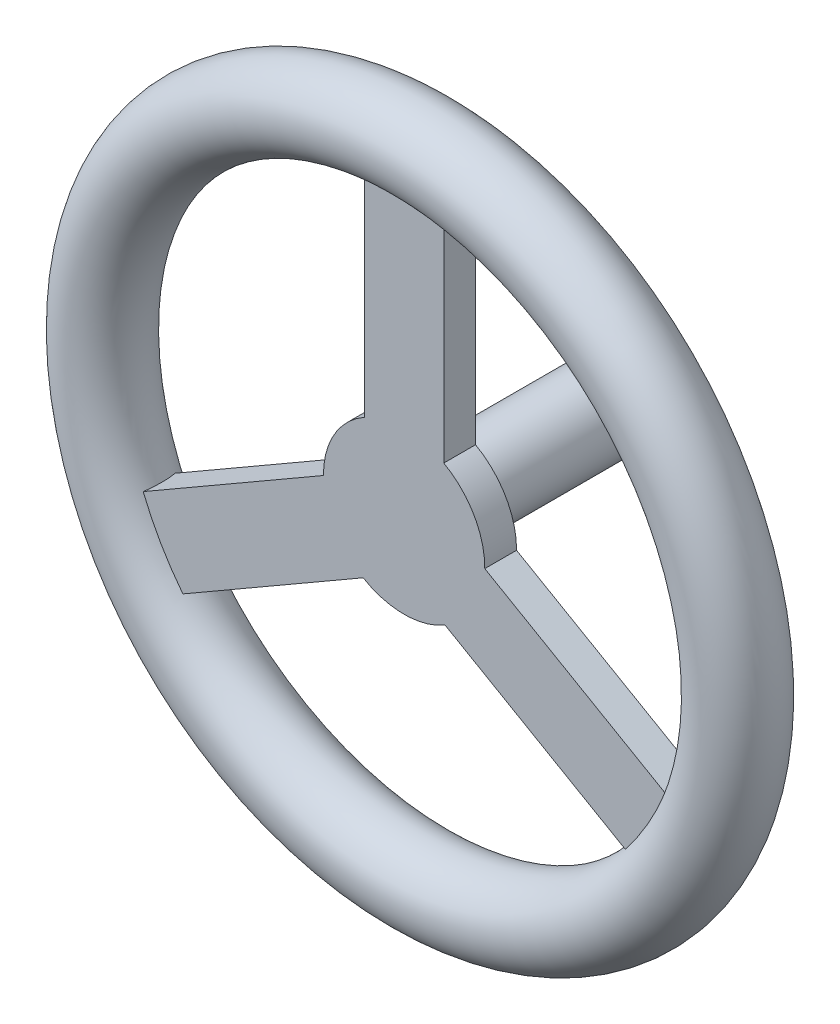
ISO-10303-21;
HEADER;
FILE_DESCRIPTION(('STEP AP214'),'2;1');
FILE_NAME('part.step','',(''),(''),'','','');
FILE_SCHEMA(('AUTOMOTIVE_DESIGN { 1 0 10303 214 1 1 1 1 }'));
ENDSEC;
DATA;
#1=APPLICATION_CONTEXT('core data for automotive mechanical design processes');
#2=APPLICATION_PROTOCOL_DEFINITION('international standard','automotive_design',2000,#1);
#3=PRODUCT_CONTEXT('',#1,'mechanical');
#4=PRODUCT('Part','Part','',(#3));
#5=PRODUCT_RELATED_PRODUCT_CATEGORY('part','',(#4));
#6=PRODUCT_DEFINITION_FORMATION('','',#4);
#7=PRODUCT_DEFINITION_CONTEXT('part definition',#1,'design');
#8=PRODUCT_DEFINITION('design','',#6,#7);
#9=PRODUCT_DEFINITION_SHAPE('','',#8);
#10=(LENGTH_UNIT() NAMED_UNIT(*) SI_UNIT(.MILLI.,.METRE.));
#11=(NAMED_UNIT(*) PLANE_ANGLE_UNIT() SI_UNIT($,.RADIAN.));
#12=(NAMED_UNIT(*) SI_UNIT($,.STERADIAN.) SOLID_ANGLE_UNIT());
#13=UNCERTAINTY_MEASURE_WITH_UNIT(LENGTH_MEASURE(1.E-05),#10,'distance_accuracy_value','');
#14=(GEOMETRIC_REPRESENTATION_CONTEXT(3) GLOBAL_UNCERTAINTY_ASSIGNED_CONTEXT((#13)) GLOBAL_UNIT_ASSIGNED_CONTEXT((#10,
#11,#12)) REPRESENTATION_CONTEXT('',''));
#15=CARTESIAN_POINT('',(0.,0.,0.));
#16=DIRECTION('',(0.,0.,1.));
#17=DIRECTION('',(1.,0.,0.));
#18=AXIS2_PLACEMENT_3D('',#15,#16,#17);
#19=CARTESIAN_POINT('',(6.25,-10.8253175473055,5.));
#20=DIRECTION('',(0.5,-0.866025403784439,0.));
#21=DIRECTION('',(0.866025403784439,0.5,0.));
#22=AXIS2_PLACEMENT_3D('',#19,#20,#21);
#23=PLANE('',#22);
#24=CARTESIAN_POINT('',(-69.6630799516573,-54.6537546924084,-5.0002));
#25=CARTESIAN_POINT('',(-69.5413531107413,-54.5834756680379,-4.68147860284593));
#26=CARTESIAN_POINT('',(-69.4312808888809,-54.5199254411166,-4.35682505741034));
#27=CARTESIAN_POINT('',(-69.2351308625508,-54.4066781706133,-3.69799138557129));
#28=CARTESIAN_POINT('',(-69.1490531545319,-54.3569811827174,-3.36381122087957));
#29=CARTESIAN_POINT('',(-69.0015696622864,-54.2718315487684,-2.6882249452108));
#30=CARTESIAN_POINT('',(-68.9401667776476,-54.2363805767932,-2.34681798995851));
#31=CARTESIAN_POINT('',(-68.8425057023006,-54.1799959286522,-1.65925928260714));
#32=CARTESIAN_POINT('',(-68.806246267319,-54.159061534105,-1.31310776616666));
#33=CARTESIAN_POINT('',(-68.759125960518,-54.1318566122891,-0.618210637502748));
#34=CARTESIAN_POINT('',(-68.7482867045349,-54.1255985649294,-0.269463070324603));
#35=CARTESIAN_POINT('',(-68.7521522750239,-54.1278303530918,0.427843293739784));
#36=CARTESIAN_POINT('',(-68.766857072376,-54.1363201718015,0.776402090840771));
#37=CARTESIAN_POINT('',(-68.8216614964472,-54.1679615207917,1.47037344266194));
#38=CARTESIAN_POINT('',(-68.8617270385241,-54.1910933722951,1.81578959001101));
#39=CARTESIAN_POINT('',(-68.9668970619562,-54.2518133136343,2.50137145902106));
#40=CARTESIAN_POINT('',(-69.0319919676568,-54.2893958749634,2.84153913692139));
#41=CARTESIAN_POINT('',(-69.1810286594354,-54.3754422490809,3.48954055940823));
#42=CARTESIAN_POINT('',(-69.2632289201448,-54.4229005917289,3.79791029589679));
#43=CARTESIAN_POINT('',(-69.448014139167,-54.5295863876737,4.40593080431716));
#44=CARTESIAN_POINT('',(-69.5505715955726,-54.5887979627368,4.70559272081878));
#45=CARTESIAN_POINT('',(-69.6630799516573,-54.6537546924084,5.0002));
#46=B_SPLINE_CURVE_WITH_KNOTS('',3,(#24,#25,#26,#27,#28,#29,#30,#31,#32,#33,#34,#35,#36,#37,#38,
#39,#40,#41,#42,#43,#44,#45),.UNSPECIFIED.,.F.,.F.,(4,2,2,2,2,2,2,2,2,2,4),(0.,1.04470646154977,
2.0894171224509,3.1342505135145,4.17903219524394,5.22470197670053,6.2703705661003,
7.31463676046712,8.35850383965663,9.32547700818342,10.2911526111836),.UNSPECIFIED.);
#47=CARTESIAN_POINT('',(-69.6630035922144,-54.6537106062635,-5.));
#48=VERTEX_POINT('',#47);
#49=CARTESIAN_POINT('',(-69.6630035922144,-54.6537106062635,5.));
#50=VERTEX_POINT('',#49);
#51=EDGE_CURVE('E207',#48,#50,#46,.T.);
#52=ORIENTED_EDGE('',*,*,#51,.F.);
#53=DIRECTION('',(-0.866025403784439,-0.5,0.));
#54=VECTOR('',#53,1.);
#55=CARTESIAN_POINT('',(6.25,-10.8253175473055,-5.));
#56=LINE('',#55,#54);
#57=CARTESIAN_POINT('',(-12.8989555850965,-21.8809722090612,-5.));
#58=VERTEX_POINT('',#57);
#59=EDGE_CURVE('E128',#58,#48,#56,.T.);
#60=ORIENTED_EDGE('',*,*,#59,.F.);
#61=DIRECTION('',(0.,0.,-1.));
#62=VECTOR('',#61,1.);
#63=CARTESIAN_POINT('',(-12.8989555850965,-21.8809722090612,5.));
#64=LINE('',#63,#62);
#65=CARTESIAN_POINT('',(-12.8989555850965,-21.8809722090612,5.));
#66=VERTEX_POINT('',#65);
#67=EDGE_CURVE('E122',#66,#58,#64,.T.);
#68=ORIENTED_EDGE('',*,*,#67,.F.);
#69=DIRECTION('',(-0.866025403784439,-0.5,0.));
#70=VECTOR('',#69,1.);
#71=CARTESIAN_POINT('',(6.25,-10.8253175473055,5.));
#72=LINE('',#71,#70);
#73=EDGE_CURVE('E126',#66,#50,#72,.T.);
#74=ORIENTED_EDGE('',*,*,#73,.T.);
#75=EDGE_LOOP('',(#52,#60,#68,#74));
#76=FACE_BOUND('',#75,.T.);
#77=ADVANCED_FACE('F35',(#76),#23,.T.);
#78=CARTESIAN_POINT('',(-6.25,-10.8253175473055,5.));
#79=DIRECTION('',(0.5,0.866025403784438,0.));
#80=DIRECTION('',(-0.866025403784439,0.5,0.));
#81=AXIS2_PLACEMENT_3D('',#78,#79,#80);
#82=PLANE('',#81);
#83=DIRECTION('',(0.866025403784439,-0.5,0.));
#84=VECTOR('',#83,1.);
#85=CARTESIAN_POINT('',(-6.25,-10.8253175473055,-5.));
#86=LINE('',#85,#84);
#87=CARTESIAN_POINT('',(12.8989555850965,-21.8809722090612,-5.));
#88=VERTEX_POINT('',#87);
#89=CARTESIAN_POINT('',(69.6630035922144,-54.6537106062635,-5.));
#90=VERTEX_POINT('',#89);
#91=EDGE_CURVE('E173',#88,#90,#86,.T.);
#92=ORIENTED_EDGE('',*,*,#91,.T.);
#93=CARTESIAN_POINT('',(69.6630799516573,-54.6537546924084,-5.0002));
#94=CARTESIAN_POINT('',(69.5413531107413,-54.583475668038,-4.68147860284593));
#95=CARTESIAN_POINT('',(69.4312808888809,-54.5199254411166,-4.35682505741034));
#96=CARTESIAN_POINT('',(69.2351308625508,-54.4066781706133,-3.69799138557128));
#97=CARTESIAN_POINT('',(69.1490531545319,-54.3569811827174,-3.36381122087957));
#98=CARTESIAN_POINT('',(69.0015696622864,-54.2718315487684,-2.6882249452108));
#99=CARTESIAN_POINT('',(68.9401667776476,-54.2363805767932,-2.34681798995851));
#100=CARTESIAN_POINT('',(68.8425057023006,-54.1799959286523,-1.65925928260713));
#101=CARTESIAN_POINT('',(68.806246267319,-54.159061534105,-1.31310776616666));
#102=CARTESIAN_POINT('',(68.759125960518,-54.1318566122891,-0.618210637502746));
#103=CARTESIAN_POINT('',(68.7482867045348,-54.1255985649294,-0.269463070324602));
#104=CARTESIAN_POINT('',(68.7521522750239,-54.1278303530919,0.427843293739786));
#105=CARTESIAN_POINT('',(68.766857072376,-54.1363201718015,0.776402090840773));
#106=CARTESIAN_POINT('',(68.8216614964472,-54.1679615207917,1.47037344266194));
#107=CARTESIAN_POINT('',(68.8617270385241,-54.1910933722951,1.81578959001101));
#108=CARTESIAN_POINT('',(68.9668970619562,-54.2518133136343,2.50137145902106));
#109=CARTESIAN_POINT('',(69.0319919676569,-54.2893958749634,2.84153913692139));
#110=CARTESIAN_POINT('',(69.1810286594354,-54.3754422490809,3.48954055940823));
#111=CARTESIAN_POINT('',(69.2632289201447,-54.4229005917289,3.7979102958968));
#112=CARTESIAN_POINT('',(69.448014139167,-54.5295863876737,4.40593080431716));
#113=CARTESIAN_POINT('',(69.5505715955725,-54.5887979627368,4.70559272081879));
#114=CARTESIAN_POINT('',(69.6630799516573,-54.6537546924084,5.0002));
#115=B_SPLINE_CURVE_WITH_KNOTS('',3,(#93,#94,#95,#96,#97,#98,#99,#100,#101,#102,#103,#104,#105,
#106,#107,#108,#109,#110,#111,#112,#113,#114),.UNSPECIFIED.,.F.,.F.,(4,2,2,2,2,2,2,2,2,2,4),(0.,
1.04470646154977,2.08941712245089,3.13425051351449,4.17903219524394,5.22470197670053,
6.2703705661003,7.31463676046712,8.35850383965663,9.32547700818341,10.2911526111836),.UNSPECIFIED.);
#116=CARTESIAN_POINT('',(69.6630035922144,-54.6537106062635,5.));
#117=VERTEX_POINT('',#116);
#118=EDGE_CURVE('E238',#90,#117,#115,.T.);
#119=ORIENTED_EDGE('',*,*,#118,.T.);
#120=DIRECTION('',(0.866025403784439,-0.5,0.));
#121=VECTOR('',#120,1.);
#122=CARTESIAN_POINT('',(-6.25,-10.8253175473055,5.));
#123=LINE('',#122,#121);
#124=CARTESIAN_POINT('',(12.8989555850965,-21.8809722090612,5.));
#125=VERTEX_POINT('',#124);
#126=EDGE_CURVE('E141',#125,#117,#123,.T.);
#127=ORIENTED_EDGE('',*,*,#126,.F.);
#128=DIRECTION('',(0.,0.,-1.));
#129=VECTOR('',#128,1.);
#130=CARTESIAN_POINT('',(12.8989555850965,-21.8809722090612,5.));
#131=LINE('',#130,#129);
#132=EDGE_CURVE('E132',#125,#88,#131,.T.);
#133=ORIENTED_EDGE('',*,*,#132,.T.);
#134=EDGE_LOOP('',(#92,#119,#127,#133));
#135=FACE_BOUND('',#134,.T.);
#136=ADVANCED_FACE('F256',(#135),#82,.F.);
#137=CARTESIAN_POINT('',(6.25,10.8253175473055,5.));
#138=DIRECTION('',(0.5,0.866025403784439,0.));
#139=DIRECTION('',(-0.866025403784439,0.5,0.));
#140=AXIS2_PLACEMENT_3D('',#137,#138,#139);
#141=PLANE('',#140);
#142=CARTESIAN_POINT('',(82.1630799516573,-33.0031195977975,-5.0002));
#143=CARTESIAN_POINT('',(82.0413531107413,-32.932840573427,-4.68147860284593));
#144=CARTESIAN_POINT('',(81.9312808888809,-32.8692903465056,-4.35682505741034));
#145=CARTESIAN_POINT('',(81.7351308625508,-32.7560430760023,-3.69799138557128));
#146=CARTESIAN_POINT('',(81.6490531545319,-32.7063460881064,-3.36381122087956));
#147=CARTESIAN_POINT('',(81.5015696622864,-32.6211964541574,-2.68822494521079));
#148=CARTESIAN_POINT('',(81.4401667776476,-32.5857454821822,-2.3468179899585));
#149=CARTESIAN_POINT('',(81.3425057023006,-32.5293608340413,-1.65925928260712));
#150=CARTESIAN_POINT('',(81.3062462673191,-32.508426439494,-1.31310776616665));
#151=CARTESIAN_POINT('',(81.259125960518,-32.4812215176782,-0.618210637502737));
#152=CARTESIAN_POINT('',(81.2482867045349,-32.4749634703185,-0.269463070324593));
#153=CARTESIAN_POINT('',(81.2521522750239,-32.4771952584809,0.427843293739795));
#154=CARTESIAN_POINT('',(81.266857072376,-32.4856850771905,0.776402090840783));
#155=CARTESIAN_POINT('',(81.3216614964472,-32.5173264261807,1.47037344266195));
#156=CARTESIAN_POINT('',(81.3617270385241,-32.5404582776841,1.81578959001102));
#157=CARTESIAN_POINT('',(81.4668970619562,-32.6011782190233,2.50137145902107));
#158=CARTESIAN_POINT('',(81.5319919676568,-32.6387607803524,2.8415391369214));
#159=CARTESIAN_POINT('',(81.6810286594354,-32.7248071544699,3.48954055940824));
#160=CARTESIAN_POINT('',(81.7632289201448,-32.7722654971179,3.7979102958968));
#161=CARTESIAN_POINT('',(81.948014139167,-32.8789512930627,4.40593080431716));
#162=CARTESIAN_POINT('',(82.0505715955726,-32.9381628681258,4.70559272081878));
#163=CARTESIAN_POINT('',(82.1630799516573,-33.0031195977974,5.0002));
#164=B_SPLINE_CURVE_WITH_KNOTS('',3,(#142,#143,#144,#145,#146,#147,#148,#149,#150,#151,#152,
#153,#154,#155,#156,#157,#158,#159,#160,#161,#162,#163),.UNSPECIFIED.,.F.,.F.,(4,2,2,2,2,2,2,2,
2,2,4),(0.,1.04470646154977,2.0894171224509,3.1342505135145,4.17903219524395,5.22470197670053,
6.27037056610031,7.31463676046713,8.35850383965664,9.32547700818342,10.2911526111836),.UNSPECIFIED.);
#165=CARTESIAN_POINT('',(82.1630035922144,-33.0030755116525,-5.));
#166=VERTEX_POINT('',#165);
#167=CARTESIAN_POINT('',(82.1630035922144,-33.0030755116525,4.99999999999999));
#168=VERTEX_POINT('',#167);
#169=EDGE_CURVE('E251',#166,#168,#164,.T.);
#170=ORIENTED_EDGE('',*,*,#169,.F.);
#171=DIRECTION('',(0.866025403784439,-0.5,0.));
#172=VECTOR('',#171,1.);
#173=CARTESIAN_POINT('',(6.25,10.8253175473055,-5.));
#174=LINE('',#173,#172);
#175=CARTESIAN_POINT('',(25.3989555850965,-0.230337114450191,-5.));
#176=VERTEX_POINT('',#175);
#177=EDGE_CURVE('E177',#176,#166,#174,.T.);
#178=ORIENTED_EDGE('',*,*,#177,.F.);
#179=DIRECTION('',(0.,0.,-1.));
#180=VECTOR('',#179,1.);
#181=CARTESIAN_POINT('',(25.3989555850965,-0.230337114450191,5.));
#182=LINE('',#181,#180);
#183=CARTESIAN_POINT('',(25.3989555850965,-0.230337114450191,5.));
#184=VERTEX_POINT('',#183);
#185=EDGE_CURVE('E193',#184,#176,#182,.T.);
#186=ORIENTED_EDGE('',*,*,#185,.F.);
#187=DIRECTION('',(0.866025403784439,-0.5,0.));
#188=VECTOR('',#187,1.);
#189=CARTESIAN_POINT('',(6.25,10.8253175473055,5.));
#190=LINE('',#189,#188);
#191=EDGE_CURVE('E158',#184,#168,#190,.T.);
#192=ORIENTED_EDGE('',*,*,#191,.T.);
#193=EDGE_LOOP('',(#170,#178,#186,#192));
#194=FACE_BOUND('',#193,.T.);
#195=ADVANCED_FACE('F263',(#194),#141,.T.);
#196=CARTESIAN_POINT('',(12.5,0.,5.));
#197=DIRECTION('',(-1.,0.,0.));
#198=DIRECTION('',(0.,-1.,0.));
#199=AXIS2_PLACEMENT_3D('',#196,#197,#198);
#200=PLANE('',#199);
#201=DIRECTION('',(0.,1.,0.));
#202=VECTOR('',#201,1.);
#203=CARTESIAN_POINT('',(12.5,0.,-5.));
#204=LINE('',#203,#202);
#205=CARTESIAN_POINT('',(12.5,22.1113093235113,-5.));
#206=VERTEX_POINT('',#205);
#207=CARTESIAN_POINT('',(12.5,87.656786117916,-5.));
#208=VERTEX_POINT('',#207);
#209=EDGE_CURVE('E180',#206,#208,#204,.T.);
#210=ORIENTED_EDGE('',*,*,#209,.T.);
#211=CARTESIAN_POINT('',(12.5,86.6025403784439,0.));
#212=CARTESIAN_POINT('',(12.5,86.6025377516233,0.348623357084614));
#213=CARTESIAN_POINT('',(12.5,86.6172828089711,0.697205725695243));
#214=CARTESIAN_POINT('',(12.5,86.6761518762042,1.39199533414966));
#215=CARTESIAN_POINT('',(12.5,86.7202836687849,1.73820192025255));
#216=CARTESIAN_POINT('',(12.5,86.8376635400475,2.42602002700812));
#217=CARTESIAN_POINT('',(12.5,86.9109428521707,2.76762621074429));
#218=CARTESIAN_POINT('',(12.5,87.0860586287015,3.44343937833544));
#219=CARTESIAN_POINT('',(12.5,87.1878951074386,3.77764635847753));
#220=CARTESIAN_POINT('',(12.5,87.4192703584334,4.43605238006105));
#221=CARTESIAN_POINT('',(12.5,87.5487888123297,4.76025856335566));
#222=CARTESIAN_POINT('',(12.5,87.8346037614038,5.39664847344035));
#223=CARTESIAN_POINT('',(12.5,87.9909006615687,5.70883201831716));
#224=CARTESIAN_POINT('',(12.5,88.3290702969491,6.31892453258682));
#225=CARTESIAN_POINT('',(12.5,88.5109368714494,6.61683691733635));
#226=CARTESIAN_POINT('',(12.5,88.8989383737499,7.19641231800365));
#227=CARTESIAN_POINT('',(12.5,89.1050733116733,7.47807532714324));
#228=CARTESIAN_POINT('',(12.5,89.5412023055799,8.0245898790154));
#229=CARTESIAN_POINT('',(12.5,89.7713104087029,8.28935040844541));
#230=CARTESIAN_POINT('',(12.5,90.2528569481494,8.79870370167323));
#231=CARTESIAN_POINT('',(12.5,90.5042954531887,9.0432964004955));
#232=CARTESIAN_POINT('',(12.5,91.0267167526055,9.51067108997637));
#233=CARTESIAN_POINT('',(12.5,91.2977009471481,9.73345151540177));
#234=CARTESIAN_POINT('',(12.5,91.8572728792769,10.1556821043304));
#235=CARTESIAN_POINT('',(12.5,92.1458607254832,10.3551321238557));
#236=CARTESIAN_POINT('',(12.5,92.7413944937891,10.7311248503914));
#237=CARTESIAN_POINT('',(12.5,93.0484873841693,10.9074348072366));
#238=CARTESIAN_POINT('',(12.5,93.6763555899319,11.2337260043615));
#239=CARTESIAN_POINT('',(12.5,93.9971309865889,11.3837070882193));
#240=CARTESIAN_POINT('',(12.5,94.6501086741138,11.6563290800717));
#241=CARTESIAN_POINT('',(12.5,94.9823113459843,11.7789690754508));
#242=CARTESIAN_POINT('',(12.5,95.6557995332502,11.9960721330613));
#243=CARTESIAN_POINT('',(12.5,95.997085080812,12.0905350954912));
#244=CARTESIAN_POINT('',(12.5,96.6888289640713,12.2512171607379));
#245=CARTESIAN_POINT('',(12.5,97.0393355884209,12.3172284494987));
#246=CARTESIAN_POINT('',(12.5,97.7446581025227,12.4195558322387));
#247=CARTESIAN_POINT('',(12.5,98.0994740149965,12.4558717695745));
#248=CARTESIAN_POINT('',(12.5,98.8109083438437,12.4985483440196));
#249=CARTESIAN_POINT('',(12.5,99.1675267859663,12.5049085519923));
#250=CARTESIAN_POINT('',(12.5,99.8800353182162,12.4876142422012));
#251=CARTESIAN_POINT('',(12.5,100.23592540852,12.4639597317123));
#252=CARTESIAN_POINT('',(12.5,100.9451532947,12.3867049337652));
#253=CARTESIAN_POINT('',(12.5,101.298484659645,12.3330455809152));
#254=CARTESIAN_POINT('',(12.5,101.999358060441,12.1960912146588));
#255=CARTESIAN_POINT('',(12.5,102.346900083247,12.1127961344844));
#256=CARTESIAN_POINT('',(12.5,103.033699771159,11.917129339296));
#257=CARTESIAN_POINT('',(12.5,103.372957474048,11.8047577569202));
#258=CARTESIAN_POINT('',(12.5,104.040744296727,11.5517018711691));
#259=CARTESIAN_POINT('',(12.5,104.369273452402,11.4110176625066));
#260=CARTESIAN_POINT('',(12.5,105.012194728944,11.1027969236845));
#261=CARTESIAN_POINT('',(12.5,105.326628632061,10.9353475491699));
#262=CARTESIAN_POINT('',(12.5,105.940194845373,10.5744328966244));
#263=CARTESIAN_POINT('',(12.5,106.239327174466,10.3809676507275));
#264=CARTESIAN_POINT('',(12.5,106.820104351768,9.96937307143533));
#265=CARTESIAN_POINT('',(12.5,107.101749586947,9.75124428411785));
#266=CARTESIAN_POINT('',(12.5,107.645494631318,9.29185166584095));
#267=CARTESIAN_POINT('',(12.5,107.907594531536,9.05058794263714));
#268=CARTESIAN_POINT('',(12.5,108.408750644738,8.54820418917083));
#269=CARTESIAN_POINT('',(12.5,108.647940162159,8.28721712974143));
#270=CARTESIAN_POINT('',(12.5,109.103356186314,7.7459222507464));
#271=CARTESIAN_POINT('',(12.5,109.31958277678,7.4656145016371));
#272=CARTESIAN_POINT('',(12.5,109.727474941551,6.88767521164813));
#273=CARTESIAN_POINT('',(12.5,109.919141182621,6.59004414138189));
#274=CARTESIAN_POINT('',(12.5,110.276500264149,5.97957709341754));
#275=CARTESIAN_POINT('',(12.5,110.44219321095,5.66674117797983));
#276=CARTESIAN_POINT('',(12.5,110.745379851691,5.03019850998838));
#277=CARTESIAN_POINT('',(12.5,110.883050671518,4.70657611236665));
#278=CARTESIAN_POINT('',(12.5,111.130527276191,4.04884690552342));
#279=CARTESIAN_POINT('',(12.5,111.240333182187,3.71474014189214));
#280=CARTESIAN_POINT('',(12.5,111.431266317169,3.03843810886367));
#281=CARTESIAN_POINT('',(12.5,111.512394205116,2.69624302551196));
#282=CARTESIAN_POINT('',(12.5,111.645373505438,2.00621070844985));
#283=CARTESIAN_POINT('',(12.5,111.69722498358,1.65837348741607));
#284=CARTESIAN_POINT('',(12.5,111.771097230248,0.961157458023747));
#285=CARTESIAN_POINT('',(12.5,111.793253483473,0.611792998087158));
#286=CARTESIAN_POINT('',(12.5,111.808012983975,-0.0875589097732477));
#287=CARTESIAN_POINT('',(12.5,111.800616333838,-0.437546355530296));
#288=CARTESIAN_POINT('',(12.5,111.756324898607,-1.13564526862723));
#289=CARTESIAN_POINT('',(12.5,111.719430462496,-1.48375675811216));
#290=CARTESIAN_POINT('',(12.5,111.616415447036,-2.17562801436668));
#291=CARTESIAN_POINT('',(12.5,111.550294864044,-2.5193877805937));
#292=CARTESIAN_POINT('',(12.5,111.389417239343,-3.19967220245449));
#293=CARTESIAN_POINT('',(12.5,111.294697116711,-3.53620559023714));
#294=CARTESIAN_POINT('',(12.5,111.077283887639,-4.20011068569361));
#295=CARTESIAN_POINT('',(12.5,110.954590824365,-4.5274824075044));
#296=CARTESIAN_POINT('',(12.5,110.682126398577,-5.17075646637364));
#297=CARTESIAN_POINT('',(12.5,110.532354980647,-5.48665877995768));
#298=CARTESIAN_POINT('',(12.5,110.206822539232,-6.10477547397309));
#299=CARTESIAN_POINT('',(12.5,110.031061454763,-6.40698982228381));
#300=CARTESIAN_POINT('',(12.5,109.654382090879,-6.99630676425227));
#301=CARTESIAN_POINT('',(12.5,109.453405993926,-7.28337240128945));
#302=CARTESIAN_POINT('',(12.5,109.028075584905,-7.8396263672496));
#303=CARTESIAN_POINT('',(12.5,108.803721254034,-8.10881468179313));
#304=CARTESIAN_POINT('',(12.5,108.33324591809,-8.62745207549043));
#305=CARTESIAN_POINT('',(12.5,108.087124560456,-8.87690083479799));
#306=CARTESIAN_POINT('',(12.5,107.574880243196,-9.35433775262142));
#307=CARTESIAN_POINT('',(12.5,107.308757206055,-9.58232582796113));
#308=CARTESIAN_POINT('',(12.5,106.756943565026,-10.0164323755001));
#309=CARTESIAN_POINT('',(12.5,106.471156679402,-10.2224284635099));
#310=CARTESIAN_POINT('',(12.5,105.883326682081,-10.6097470061177));
#311=CARTESIAN_POINT('',(12.5,105.581283522544,-10.7910693880984));
#312=CARTESIAN_POINT('',(12.5,104.963080438527,-11.1278140859908));
#313=CARTESIAN_POINT('',(12.5,104.646920168383,-11.2832357672691));
#314=CARTESIAN_POINT('',(12.5,104.00272346922,-11.5671291831648));
#315=CARTESIAN_POINT('',(12.5,103.674686989854,-11.6956008035147));
#316=CARTESIAN_POINT('',(12.5,103.006820307012,-11.9255037064177));
#317=CARTESIAN_POINT('',(12.5,102.666926008412,-12.026748817561));
#318=CARTESIAN_POINT('',(12.5,101.97984600814,-12.2003861454244));
#319=CARTESIAN_POINT('',(12.5,101.632660275354,-12.2727782389954));
#320=CARTESIAN_POINT('',(12.5,100.9334361258,-12.3882358541877));
#321=CARTESIAN_POINT('',(12.5,100.581397563838,-12.4313004963941));
#322=CARTESIAN_POINT('',(12.5,99.8749518381538,-12.4878248037309));
#323=CARTESIAN_POINT('',(12.5,99.5205446672033,-12.501284378461));
#324=CARTESIAN_POINT('',(12.5,98.8098380995149,-12.4985150060336));
#325=CARTESIAN_POINT('',(12.5,98.4535393501374,-12.4821175384157));
#326=CARTESIAN_POINT('',(12.5,97.7435804278755,-12.4194304741705));
#327=CARTESIAN_POINT('',(12.5,97.3899202660808,-12.3731407519816));
#328=CARTESIAN_POINT('',(12.5,96.6877351873976,-12.2509950043796));
#329=CARTESIAN_POINT('',(12.5,96.3392103766921,-12.1751383685032));
#330=CARTESIAN_POINT('',(12.5,95.6497740767708,-11.9943849075933));
#331=CARTESIAN_POINT('',(12.5,95.3088625888036,-11.8894880777978));
#332=CARTESIAN_POINT('',(12.5,94.6363996266019,-11.6511363390737));
#333=CARTESIAN_POINT('',(12.5,94.3048683628792,-11.517624400895));
#334=CARTESIAN_POINT('',(12.5,93.6542588149929,-11.2230882932696));
#335=CARTESIAN_POINT('',(12.5,93.3351805623632,-11.0620640541609));
#336=CARTESIAN_POINT('',(12.5,92.7117920127648,-10.7136221392883));
#337=CARTESIAN_POINT('',(12.5,92.4074811049508,-10.5262055564864));
#338=CARTESIAN_POINT('',(12.5,91.8158254599722,-10.1262722915553));
#339=CARTESIAN_POINT('',(12.5,91.5284806425698,-9.91375572814579));
#340=CARTESIAN_POINT('',(12.5,90.9738575247267,-9.46590519790329));
#341=CARTESIAN_POINT('',(12.5,90.7065110906456,-9.23065561165872));
#342=CARTESIAN_POINT('',(12.5,90.1927174175859,-8.73834051826698));
#343=CARTESIAN_POINT('',(12.5,89.9462702380754,-8.48127494904726));
#344=CARTESIAN_POINT('',(12.5,89.4760540492702,-7.9470715710099));
#345=CARTESIAN_POINT('',(12.5,89.2522902143195,-7.66992920704411));
#346=CARTESIAN_POINT('',(12.5,88.829191061314,-7.09759228112048));
#347=CARTESIAN_POINT('',(12.5,88.6298551870271,-6.80239813043678));
#348=CARTESIAN_POINT('',(12.5,88.2585718294042,-6.19842145385712));
#349=CARTESIAN_POINT('',(12.5,88.0864234689514,-5.8897624090436));
#350=CARTESIAN_POINT('',(12.5,87.7689659806212,-5.25893879501069));
#351=CARTESIAN_POINT('',(12.5,87.6236566763366,-4.93677431457672));
#352=CARTESIAN_POINT('',(12.5,87.361135865621,-4.28161258092913));
#353=CARTESIAN_POINT('',(12.5,87.2438925582572,-3.9486280783851));
#354=CARTESIAN_POINT('',(12.5,87.0382232499698,-3.27399606225038));
#355=CARTESIAN_POINT('',(12.5,86.9497893073659,-2.93235096410382));
#356=CARTESIAN_POINT('',(12.5,86.78527105415,-2.16269533215809));
#357=CARTESIAN_POINT('',(12.5,86.7168097152317,-1.73303400447731));
#358=CARTESIAN_POINT('',(12.5,86.6254461472065,-0.868893884349574));
#359=CARTESIAN_POINT('',(12.5,86.6025436516915,-0.434415120087825));
#360=CARTESIAN_POINT('',(12.5,86.6025403784439,0.));
#361=B_SPLINE_CURVE_WITH_KNOTS('',3,(#211,#212,#213,#214,#215,#216,#217,#218,#219,#220,#221,
#222,#223,#224,#225,#226,#227,#228,#229,#230,#231,#232,#233,#234,#235,#236,#237,#238,#239,#240,
#241,#242,#243,#244,#245,#246,#247,#248,#249,#250,#251,#252,#253,#254,#255,#256,#257,#258,#259,
#260,#261,#262,#263,#264,#265,#266,#267,#268,#269,#270,#271,#272,#273,#274,#275,#276,#277,#278,
#279,#280,#281,#282,#283,#284,#285,#286,#287,#288,#289,#290,#291,#292,#293,#294,#295,#296,#297,
#298,#299,#300,#301,#302,#303,#304,#305,#306,#307,#308,#309,#310,#311,#312,#313,#314,#315,#316,
#317,#318,#319,#320,#321,#322,#323,#324,#325,#326,#327,#328,#329,#330,#331,#332,#333,#334,#335,
#336,#337,#338,#339,#340,#341,#342,#343,#344,#345,#346,#347,#348,#349,#350,#351,#352,#353,#354,
#355,#356,#357,#358,#359,#360),.UNSPECIFIED.,.T.,.F.,(4,2,2,2,2,2,2,2,2,2,2,2,2,2,2,2,2,2,2,2,2,
2,2,2,2,2,2,2,2,2,2,2,2,2,2,2,2,2,2,2,2,2,2,2,2,2,2,2,2,2,2,2,2,2,2,2,2,2,2,2,2,2,2,2,2,2,2,2,2,
2,2,2,2,2,4),(0.,1.04548811425239,2.09125322264702,3.13814196761077,4.18503123788768,
5.23115472212589,6.27729402893403,7.32318171123834,8.36906982981537,9.42018282723103,
10.4712992109288,11.5224909667923,12.5736892094919,13.6347607504408,14.6958385950777,
15.7569518520201,16.8180688673267,17.8868102000854,18.9555571704382,20.0243194512892,
21.0930814730999,22.1639548279721,23.2348305954953,24.3057014780959,25.3765687784259,
26.4440174990107,27.5114649011331,28.5788886734313,29.6463074742302,30.7070808364884,
31.767850330652,32.8285910208937,33.8893273680078,34.9431350671068,35.9969381844624,
37.0507170860505,38.1044936203651,39.1534457352897,40.2023942090185,41.251330273014,
42.3002664677878,43.3478543408386,44.3954405973144,45.4430289977616,46.4906198563885,
47.540658293611,48.5906975754109,49.6407538678453,50.6908142298634,51.7464429861832,
52.8020748492597,53.8577325742175,54.9133947750491,55.9761017964061,57.038813353513,
58.1015567757574,59.1643034431278,60.2330671171255,61.3018352804593,62.3706255116499,
63.4394159181022,64.5103565421491,65.5812998778921,66.6521988766666,67.7230928104239,
68.7901542380615,69.8572187018884,70.9245260308104,71.9918090523063,73.0507947236394,
74.1097734342379,75.1675464999649,76.2250277294128,77.5278047560209,78.830574164535),.UNSPECIFIED.);
#362=CARTESIAN_POINT('',(12.5,87.6567861179099,4.99999999998605));
#363=VERTEX_POINT('',#362);
#364=EDGE_CURVE('E237',#208,#363,#361,.T.);
#365=ORIENTED_EDGE('',*,*,#364,.T.);
#366=DIRECTION('',(0.,1.,0.));
#367=VECTOR('',#366,1.);
#368=CARTESIAN_POINT('',(12.5,0.,5.));
#369=LINE('',#368,#367);
#370=CARTESIAN_POINT('',(12.5,22.1113093235113,5.));
#371=VERTEX_POINT('',#370);
#372=EDGE_CURVE('E161',#371,#363,#369,.T.);
#373=ORIENTED_EDGE('',*,*,#372,.F.);
#374=DIRECTION('',(0.,0.,-1.));
#375=VECTOR('',#374,1.);
#376=CARTESIAN_POINT('',(12.5,22.1113093235113,5.));
#377=LINE('',#376,#375);
#378=EDGE_CURVE('E190',#371,#206,#377,.T.);
#379=ORIENTED_EDGE('',*,*,#378,.T.);
#380=EDGE_LOOP('',(#210,#365,#373,#379));
#381=FACE_BOUND('',#380,.T.);
#382=ADVANCED_FACE('F229',(#381),#200,.F.);
#383=CARTESIAN_POINT('',(-12.5,0.,5.));
#384=DIRECTION('',(-1.,0.,0.));
#385=DIRECTION('',(0.,-1.,0.));
#386=AXIS2_PLACEMENT_3D('',#383,#384,#385);
#387=PLANE('',#386);
#388=CARTESIAN_POINT('',(-12.5,86.6025403784439,0.));
#389=CARTESIAN_POINT('',(-12.5,86.6025377516233,0.348623357084614));
#390=CARTESIAN_POINT('',(-12.5,86.6172828089711,0.697205725695243));
#391=CARTESIAN_POINT('',(-12.5,86.6761518762042,1.39199533414966));
#392=CARTESIAN_POINT('',(-12.5,86.7202836687849,1.73820192025255));
#393=CARTESIAN_POINT('',(-12.5,86.8376635400475,2.42602002700812));
#394=CARTESIAN_POINT('',(-12.5,86.9109428521707,2.76762621074429));
#395=CARTESIAN_POINT('',(-12.5,87.0860586287015,3.44343937833544));
#396=CARTESIAN_POINT('',(-12.5,87.1878951074386,3.77764635847753));
#397=CARTESIAN_POINT('',(-12.5,87.4192703584334,4.43605238006105));
#398=CARTESIAN_POINT('',(-12.5,87.5487888123297,4.76025856335566));
#399=CARTESIAN_POINT('',(-12.5,87.8346037614038,5.39664847344035));
#400=CARTESIAN_POINT('',(-12.5,87.9909006615687,5.70883201831716));
#401=CARTESIAN_POINT('',(-12.5,88.3290702969491,6.31892453258682));
#402=CARTESIAN_POINT('',(-12.5,88.5109368714494,6.61683691733635));
#403=CARTESIAN_POINT('',(-12.5,88.8989383737499,7.19641231800365));
#404=CARTESIAN_POINT('',(-12.5,89.1050733116733,7.47807532714324));
#405=CARTESIAN_POINT('',(-12.5,89.5412023055799,8.0245898790154));
#406=CARTESIAN_POINT('',(-12.5,89.7713104087029,8.28935040844541));
#407=CARTESIAN_POINT('',(-12.5,90.2528569481494,8.79870370167323));
#408=CARTESIAN_POINT('',(-12.5,90.5042954531887,9.0432964004955));
#409=CARTESIAN_POINT('',(-12.5,91.0267167526055,9.51067108997637));
#410=CARTESIAN_POINT('',(-12.5,91.2977009471481,9.73345151540177));
#411=CARTESIAN_POINT('',(-12.5,91.8572728792769,10.1556821043304));
#412=CARTESIAN_POINT('',(-12.5,92.1458607254832,10.3551321238557));
#413=CARTESIAN_POINT('',(-12.5,92.7413944937891,10.7311248503914));
#414=CARTESIAN_POINT('',(-12.5,93.0484873841693,10.9074348072366));
#415=CARTESIAN_POINT('',(-12.5,93.6763555899319,11.2337260043615));
#416=CARTESIAN_POINT('',(-12.5,93.9971309865889,11.3837070882193));
#417=CARTESIAN_POINT('',(-12.5,94.6501086741138,11.6563290800717));
#418=CARTESIAN_POINT('',(-12.5,94.9823113459843,11.7789690754508));
#419=CARTESIAN_POINT('',(-12.5,95.6557995332502,11.9960721330613));
#420=CARTESIAN_POINT('',(-12.5,95.997085080812,12.0905350954912));
#421=CARTESIAN_POINT('',(-12.5,96.6888289640713,12.2512171607379));
#422=CARTESIAN_POINT('',(-12.5,97.0393355884209,12.3172284494987));
#423=CARTESIAN_POINT('',(-12.5,97.7446581025227,12.4195558322387));
#424=CARTESIAN_POINT('',(-12.5,98.0994740149965,12.4558717695745));
#425=CARTESIAN_POINT('',(-12.5,98.8109083438437,12.4985483440196));
#426=CARTESIAN_POINT('',(-12.5,99.1675267859663,12.5049085519923));
#427=CARTESIAN_POINT('',(-12.5,99.8800353182162,12.4876142422012));
#428=CARTESIAN_POINT('',(-12.5,100.23592540852,12.4639597317123));
#429=CARTESIAN_POINT('',(-12.5,100.9451532947,12.3867049337652));
#430=CARTESIAN_POINT('',(-12.5,101.298484659645,12.3330455809152));
#431=CARTESIAN_POINT('',(-12.5,101.999358060441,12.1960912146588));
#432=CARTESIAN_POINT('',(-12.5,102.346900083247,12.1127961344844));
#433=CARTESIAN_POINT('',(-12.5,103.033699771159,11.917129339296));
#434=CARTESIAN_POINT('',(-12.5,103.372957474048,11.8047577569202));
#435=CARTESIAN_POINT('',(-12.5,104.040744296727,11.5517018711691));
#436=CARTESIAN_POINT('',(-12.5,104.369273452402,11.4110176625066));
#437=CARTESIAN_POINT('',(-12.5,105.012194728944,11.1027969236845));
#438=CARTESIAN_POINT('',(-12.5,105.326628632061,10.9353475491699));
#439=CARTESIAN_POINT('',(-12.5,105.940194845373,10.5744328966244));
#440=CARTESIAN_POINT('',(-12.5,106.239327174466,10.3809676507275));
#441=CARTESIAN_POINT('',(-12.5,106.820104351768,9.96937307143533));
#442=CARTESIAN_POINT('',(-12.5,107.101749586947,9.75124428411785));
#443=CARTESIAN_POINT('',(-12.5,107.645494631318,9.29185166584095));
#444=CARTESIAN_POINT('',(-12.5,107.907594531536,9.05058794263714));
#445=CARTESIAN_POINT('',(-12.5,108.408750644738,8.54820418917083));
#446=CARTESIAN_POINT('',(-12.5,108.647940162159,8.28721712974143));
#447=CARTESIAN_POINT('',(-12.5,109.103356186314,7.7459222507464));
#448=CARTESIAN_POINT('',(-12.5,109.31958277678,7.4656145016371));
#449=CARTESIAN_POINT('',(-12.5,109.727474941551,6.88767521164813));
#450=CARTESIAN_POINT('',(-12.5,109.919141182621,6.59004414138189));
#451=CARTESIAN_POINT('',(-12.5,110.276500264149,5.97957709341754));
#452=CARTESIAN_POINT('',(-12.5,110.44219321095,5.66674117797983));
#453=CARTESIAN_POINT('',(-12.5,110.745379851691,5.03019850998838));
#454=CARTESIAN_POINT('',(-12.5,110.883050671518,4.70657611236665));
#455=CARTESIAN_POINT('',(-12.5,111.130527276191,4.04884690552342));
#456=CARTESIAN_POINT('',(-12.5,111.240333182187,3.71474014189214));
#457=CARTESIAN_POINT('',(-12.5,111.431266317169,3.03843810886367));
#458=CARTESIAN_POINT('',(-12.5,111.512394205116,2.69624302551196));
#459=CARTESIAN_POINT('',(-12.5,111.645373505438,2.00621070844985));
#460=CARTESIAN_POINT('',(-12.5,111.69722498358,1.65837348741607));
#461=CARTESIAN_POINT('',(-12.5,111.771097230248,0.961157458023747));
#462=CARTESIAN_POINT('',(-12.5,111.793253483473,0.611792998087158));
#463=CARTESIAN_POINT('',(-12.5,111.808012983975,-0.0875589097732477));
#464=CARTESIAN_POINT('',(-12.5,111.800616333838,-0.437546355530296));
#465=CARTESIAN_POINT('',(-12.5,111.756324898607,-1.13564526862723));
#466=CARTESIAN_POINT('',(-12.5,111.719430462496,-1.48375675811216));
#467=CARTESIAN_POINT('',(-12.5,111.616415447036,-2.17562801436668));
#468=CARTESIAN_POINT('',(-12.5,111.550294864044,-2.5193877805937));
#469=CARTESIAN_POINT('',(-12.5,111.389417239343,-3.19967220245449));
#470=CARTESIAN_POINT('',(-12.5,111.294697116711,-3.53620559023714));
#471=CARTESIAN_POINT('',(-12.5,111.077283887639,-4.20011068569361));
#472=CARTESIAN_POINT('',(-12.5,110.954590824365,-4.5274824075044));
#473=CARTESIAN_POINT('',(-12.5,110.682126398577,-5.17075646637364));
#474=CARTESIAN_POINT('',(-12.5,110.532354980647,-5.48665877995768));
#475=CARTESIAN_POINT('',(-12.5,110.206822539232,-6.10477547397309));
#476=CARTESIAN_POINT('',(-12.5,110.031061454763,-6.40698982228381));
#477=CARTESIAN_POINT('',(-12.5,109.654382090879,-6.99630676425227));
#478=CARTESIAN_POINT('',(-12.5,109.453405993926,-7.28337240128945));
#479=CARTESIAN_POINT('',(-12.5,109.028075584905,-7.8396263672496));
#480=CARTESIAN_POINT('',(-12.5,108.803721254034,-8.10881468179313));
#481=CARTESIAN_POINT('',(-12.5,108.33324591809,-8.62745207549043));
#482=CARTESIAN_POINT('',(-12.5,108.087124560456,-8.87690083479799));
#483=CARTESIAN_POINT('',(-12.5,107.574880243196,-9.35433775262142));
#484=CARTESIAN_POINT('',(-12.5,107.308757206055,-9.58232582796113));
#485=CARTESIAN_POINT('',(-12.5,106.756943565026,-10.0164323755001));
#486=CARTESIAN_POINT('',(-12.5,106.471156679402,-10.2224284635099));
#487=CARTESIAN_POINT('',(-12.5,105.883326682081,-10.6097470061177));
#488=CARTESIAN_POINT('',(-12.5,105.581283522544,-10.7910693880984));
#489=CARTESIAN_POINT('',(-12.5,104.963080438527,-11.1278140859908));
#490=CARTESIAN_POINT('',(-12.5,104.646920168383,-11.2832357672691));
#491=CARTESIAN_POINT('',(-12.5,104.00272346922,-11.5671291831648));
#492=CARTESIAN_POINT('',(-12.5,103.674686989854,-11.6956008035147));
#493=CARTESIAN_POINT('',(-12.5,103.006820307012,-11.9255037064177));
#494=CARTESIAN_POINT('',(-12.5,102.666926008412,-12.026748817561));
#495=CARTESIAN_POINT('',(-12.5,101.97984600814,-12.2003861454244));
#496=CARTESIAN_POINT('',(-12.5,101.632660275354,-12.2727782389954));
#497=CARTESIAN_POINT('',(-12.5,100.9334361258,-12.3882358541877));
#498=CARTESIAN_POINT('',(-12.5,100.581397563838,-12.4313004963941));
#499=CARTESIAN_POINT('',(-12.5,99.8749518381538,-12.4878248037309));
#500=CARTESIAN_POINT('',(-12.5,99.5205446672033,-12.501284378461));
#501=CARTESIAN_POINT('',(-12.5,98.8098380995149,-12.4985150060336));
#502=CARTESIAN_POINT('',(-12.5,98.4535393501374,-12.4821175384157));
#503=CARTESIAN_POINT('',(-12.5,97.7435804278755,-12.4194304741705));
#504=CARTESIAN_POINT('',(-12.5,97.3899202660808,-12.3731407519816));
#505=CARTESIAN_POINT('',(-12.5,96.6877351873976,-12.2509950043796));
#506=CARTESIAN_POINT('',(-12.5,96.3392103766921,-12.1751383685032));
#507=CARTESIAN_POINT('',(-12.5,95.6497740767708,-11.9943849075933));
#508=CARTESIAN_POINT('',(-12.5,95.3088625888036,-11.8894880777978));
#509=CARTESIAN_POINT('',(-12.5,94.6363996266019,-11.6511363390737));
#510=CARTESIAN_POINT('',(-12.5,94.3048683628792,-11.517624400895));
#511=CARTESIAN_POINT('',(-12.5,93.6542588149929,-11.2230882932696));
#512=CARTESIAN_POINT('',(-12.5,93.3351805623632,-11.0620640541609));
#513=CARTESIAN_POINT('',(-12.5,92.7117920127648,-10.7136221392883));
#514=CARTESIAN_POINT('',(-12.5,92.4074811049508,-10.5262055564864));
#515=CARTESIAN_POINT('',(-12.5,91.8158254599722,-10.1262722915553));
#516=CARTESIAN_POINT('',(-12.5,91.5284806425698,-9.91375572814579));
#517=CARTESIAN_POINT('',(-12.5,90.9738575247267,-9.46590519790329));
#518=CARTESIAN_POINT('',(-12.5,90.7065110906456,-9.23065561165872));
#519=CARTESIAN_POINT('',(-12.5,90.1927174175859,-8.73834051826698));
#520=CARTESIAN_POINT('',(-12.5,89.9462702380754,-8.48127494904726));
#521=CARTESIAN_POINT('',(-12.5,89.4760540492702,-7.9470715710099));
#522=CARTESIAN_POINT('',(-12.5,89.2522902143195,-7.66992920704411));
#523=CARTESIAN_POINT('',(-12.5,88.829191061314,-7.09759228112048));
#524=CARTESIAN_POINT('',(-12.5,88.6298551870271,-6.80239813043678));
#525=CARTESIAN_POINT('',(-12.5,88.2585718294042,-6.19842145385712));
#526=CARTESIAN_POINT('',(-12.5,88.0864234689514,-5.8897624090436));
#527=CARTESIAN_POINT('',(-12.5,87.7689659806212,-5.25893879501069));
#528=CARTESIAN_POINT('',(-12.5,87.6236566763366,-4.93677431457672));
#529=CARTESIAN_POINT('',(-12.5,87.361135865621,-4.28161258092913));
#530=CARTESIAN_POINT('',(-12.5,87.2438925582572,-3.9486280783851));
#531=CARTESIAN_POINT('',(-12.5,87.0382232499698,-3.27399606225038));
#532=CARTESIAN_POINT('',(-12.5,86.9497893073659,-2.93235096410382));
#533=CARTESIAN_POINT('',(-12.5,86.78527105415,-2.16269533215809));
#534=CARTESIAN_POINT('',(-12.5,86.7168097152317,-1.73303400447731));
#535=CARTESIAN_POINT('',(-12.5,86.6254461472065,-0.868893884349574));
#536=CARTESIAN_POINT('',(-12.5,86.6025436516915,-0.434415120087825));
#537=CARTESIAN_POINT('',(-12.5,86.6025403784439,0.));
#538=B_SPLINE_CURVE_WITH_KNOTS('',3,(#388,#389,#390,#391,#392,#393,#394,#395,#396,#397,#398,
#399,#400,#401,#402,#403,#404,#405,#406,#407,#408,#409,#410,#411,#412,#413,#414,#415,#416,#417,
#418,#419,#420,#421,#422,#423,#424,#425,#426,#427,#428,#429,#430,#431,#432,#433,#434,#435,#436,
#437,#438,#439,#440,#441,#442,#443,#444,#445,#446,#447,#448,#449,#450,#451,#452,#453,#454,#455,
#456,#457,#458,#459,#460,#461,#462,#463,#464,#465,#466,#467,#468,#469,#470,#471,#472,#473,#474,
#475,#476,#477,#478,#479,#480,#481,#482,#483,#484,#485,#486,#487,#488,#489,#490,#491,#492,#493,
#494,#495,#496,#497,#498,#499,#500,#501,#502,#503,#504,#505,#506,#507,#508,#509,#510,#511,#512,
#513,#514,#515,#516,#517,#518,#519,#520,#521,#522,#523,#524,#525,#526,#527,#528,#529,#530,#531,
#532,#533,#534,#535,#536,#537),.UNSPECIFIED.,.T.,.F.,(4,2,2,2,2,2,2,2,2,2,2,2,2,2,2,2,2,2,2,2,2,
2,2,2,2,2,2,2,2,2,2,2,2,2,2,2,2,2,2,2,2,2,2,2,2,2,2,2,2,2,2,2,2,2,2,2,2,2,2,2,2,2,2,2,2,2,2,2,2,
2,2,2,2,2,4),(0.,1.04548811425239,2.09125322264702,3.13814196761077,4.18503123788768,
5.23115472212589,6.27729402893403,7.32318171123834,8.36906982981537,9.42018282723103,
10.4712992109288,11.5224909667923,12.5736892094919,13.6347607504408,14.6958385950777,
15.7569518520201,16.8180688673267,17.8868102000854,18.9555571704382,20.0243194512892,
21.0930814730999,22.1639548279721,23.2348305954953,24.3057014780959,25.3765687784259,
26.4440174990107,27.5114649011331,28.5788886734313,29.6463074742302,30.7070808364884,
31.767850330652,32.8285910208937,33.8893273680078,34.9431350671068,35.9969381844624,
37.0507170860505,38.1044936203651,39.1534457352897,40.2023942090185,41.251330273014,
42.3002664677878,43.3478543408386,44.3954405973144,45.4430289977616,46.4906198563885,
47.540658293611,48.5906975754109,49.6407538678453,50.6908142298634,51.7464429861832,
52.8020748492597,53.8577325742175,54.9133947750491,55.9761017964061,57.038813353513,
58.1015567757574,59.1643034431278,60.2330671171255,61.3018352804593,62.3706255116499,
63.4394159181022,64.5103565421491,65.5812998778921,66.6521988766666,67.7230928104239,
68.7901542380615,69.8572187018884,70.9245260308104,71.9918090523063,73.0507947236394,
74.1097734342379,75.1675464999649,76.2250277294128,77.5278047560209,78.830574164535),.UNSPECIFIED.);
#539=CARTESIAN_POINT('',(-12.5,87.656786117916,-5.));
#540=VERTEX_POINT('',#539);
#541=CARTESIAN_POINT('',(-12.5,87.6567861179099,4.99999999998605));
#542=VERTEX_POINT('',#541);
#543=EDGE_CURVE('E55',#540,#542,#538,.T.);
#544=ORIENTED_EDGE('',*,*,#543,.F.);
#545=DIRECTION('',(0.,1.,0.));
#546=VECTOR('',#545,1.);
#547=CARTESIAN_POINT('',(-12.5,0.,-5.));
#548=LINE('',#547,#546);
#549=CARTESIAN_POINT('',(-12.5,22.1113093235113,-5.));
#550=VERTEX_POINT('',#549);
#551=EDGE_CURVE('E183',#550,#540,#548,.T.);
#552=ORIENTED_EDGE('',*,*,#551,.F.);
#553=DIRECTION('',(0.,0.,-1.));
#554=VECTOR('',#553,1.);
#555=CARTESIAN_POINT('',(-12.5,22.1113093235113,5.));
#556=LINE('',#555,#554);
#557=CARTESIAN_POINT('',(-12.5,22.1113093235113,5.));
#558=VERTEX_POINT('',#557);
#559=EDGE_CURVE('E188',#558,#550,#556,.T.);
#560=ORIENTED_EDGE('',*,*,#559,.F.);
#561=DIRECTION('',(0.,1.,0.));
#562=VECTOR('',#561,1.);
#563=CARTESIAN_POINT('',(-12.5,0.,5.));
#564=LINE('',#563,#562);
#565=EDGE_CURVE('E164',#558,#542,#564,.T.);
#566=ORIENTED_EDGE('',*,*,#565,.T.);
#567=EDGE_LOOP('',(#544,#552,#560,#566));
#568=FACE_BOUND('',#567,.T.);
#569=ADVANCED_FACE('F217',(#568),#387,.T.);
#570=CARTESIAN_POINT('',(-6.25,10.8253175473055,5.));
#571=DIRECTION('',(0.5,-0.866025403784439,0.));
#572=DIRECTION('',(0.866025403784439,0.5,0.));
#573=AXIS2_PLACEMENT_3D('',#570,#571,#572);
#574=PLANE('',#573);
#575=DIRECTION('',(-0.866025403784439,-0.5,0.));
#576=VECTOR('',#575,1.);
#577=CARTESIAN_POINT('',(-6.25,10.8253175473055,-5.));
#578=LINE('',#577,#576);
#579=CARTESIAN_POINT('',(-25.3989555850965,-0.230337114450191,-5.));
#580=VERTEX_POINT('',#579);
#581=CARTESIAN_POINT('',(-82.1630035922144,-33.0030755116525,-5.));
#582=VERTEX_POINT('',#581);
#583=EDGE_CURVE('E149',#580,#582,#578,.T.);
#584=ORIENTED_EDGE('',*,*,#583,.T.);
#585=CARTESIAN_POINT('',(-82.1630799516573,-33.0031195977975,-5.0002));
#586=CARTESIAN_POINT('',(-82.0413531107413,-32.932840573427,-4.68147860284593));
#587=CARTESIAN_POINT('',(-81.9312808888809,-32.8692903465056,-4.35682505741034));
#588=CARTESIAN_POINT('',(-81.7351308625508,-32.7560430760023,-3.69799138557128));
#589=CARTESIAN_POINT('',(-81.6490531545319,-32.7063460881064,-3.36381122087956));
#590=CARTESIAN_POINT('',(-81.5015696622864,-32.6211964541574,-2.68822494521079));
#591=CARTESIAN_POINT('',(-81.4401667776476,-32.5857454821822,-2.3468179899585));
#592=CARTESIAN_POINT('',(-81.3425057023006,-32.5293608340413,-1.65925928260713));
#593=CARTESIAN_POINT('',(-81.3062462673191,-32.508426439494,-1.31310776616665));
#594=CARTESIAN_POINT('',(-81.259125960518,-32.4812215176782,-0.618210637502737));
#595=CARTESIAN_POINT('',(-81.2482867045349,-32.4749634703185,-0.269463070324592));
#596=CARTESIAN_POINT('',(-81.2521522750239,-32.4771952584809,0.427843293739796));
#597=CARTESIAN_POINT('',(-81.266857072376,-32.4856850771905,0.776402090840783));
#598=CARTESIAN_POINT('',(-81.3216614964472,-32.5173264261807,1.47037344266195));
#599=CARTESIAN_POINT('',(-81.3617270385241,-32.5404582776841,1.81578959001102));
#600=CARTESIAN_POINT('',(-81.4668970619562,-32.6011782190233,2.50137145902107));
#601=CARTESIAN_POINT('',(-81.5319919676568,-32.6387607803524,2.8415391369214));
#602=CARTESIAN_POINT('',(-81.6810286594354,-32.7248071544699,3.48954055940824));
#603=CARTESIAN_POINT('',(-81.7632289201447,-32.7722654971179,3.7979102958968));
#604=CARTESIAN_POINT('',(-81.948014139167,-32.8789512930627,4.40593080431716));
#605=CARTESIAN_POINT('',(-82.0505715955726,-32.9381628681258,4.70559272081879));
#606=CARTESIAN_POINT('',(-82.1630799516573,-33.0031195977975,5.0002));
#607=B_SPLINE_CURVE_WITH_KNOTS('',3,(#585,#586,#587,#588,#589,#590,#591,#592,#593,#594,#595,
#596,#597,#598,#599,#600,#601,#602,#603,#604,#605,#606),.UNSPECIFIED.,.F.,.F.,(4,2,2,2,2,2,2,2,
2,2,4),(0.,1.04470646154977,2.0894171224509,3.1342505135145,4.17903219524394,5.22470197670053,
6.27037056610031,7.31463676046713,8.35850383965664,9.32547700818341,10.2911526111836),.UNSPECIFIED.);
#608=CARTESIAN_POINT('',(-82.1630035922144,-33.0030755116525,5.));
#609=VERTEX_POINT('',#608);
#610=EDGE_CURVE('E198',#582,#609,#607,.T.);
#611=ORIENTED_EDGE('',*,*,#610,.T.);
#612=DIRECTION('',(-0.866025403784439,-0.5,0.));
#613=VECTOR('',#612,1.);
#614=CARTESIAN_POINT('',(-6.25,10.8253175473055,5.));
#615=LINE('',#614,#613);
#616=CARTESIAN_POINT('',(-25.3989555850965,-0.230337114450191,5.));
#617=VERTEX_POINT('',#616);
#618=EDGE_CURVE('E167',#617,#609,#615,.T.);
#619=ORIENTED_EDGE('',*,*,#618,.F.);
#620=DIRECTION('',(0.,0.,-1.));
#621=VECTOR('',#620,1.);
#622=CARTESIAN_POINT('',(-25.3989555850965,-0.230337114450191,5.));
#623=LINE('',#622,#621);
#624=EDGE_CURVE('E169',#617,#580,#623,.T.);
#625=ORIENTED_EDGE('',*,*,#624,.T.);
#626=EDGE_LOOP('',(#584,#611,#619,#625));
#627=FACE_BOUND('',#626,.T.);
#628=ADVANCED_FACE('F212',(#627),#574,.F.);
#629=CARTESIAN_POINT('',(0.,0.,5.));
#630=DIRECTION('',(0.,0.,1.));
#631=DIRECTION('',(1.,0.,0.));
#632=AXIS2_PLACEMENT_3D('',#629,#630,#631);
#633=PLANE('',#632);
#634=CARTESIAN_POINT('',(0.,0.,5.));
#635=DIRECTION('',(0.,0.,-1.));
#636=DIRECTION('',(-1.,0.,0.));
#637=AXIS2_PLACEMENT_3D('',#634,#635,#636);
#638=CIRCLE('',#637,88.5435607626104);
#639=EDGE_CURVE('E44',#542,#363,#638,.T.);
#640=ORIENTED_EDGE('',*,*,#639,.F.);
#641=ORIENTED_EDGE('',*,*,#565,.F.);
#642=CARTESIAN_POINT('',(0.,0.,5.));
#643=DIRECTION('',(0.,0.,1.));
#644=DIRECTION('',(1.,0.,0.));
#645=AXIS2_PLACEMENT_3D('',#642,#643,#644);
#646=CIRCLE('',#645,25.4);
#647=EDGE_CURVE('E143',#558,#617,#646,.T.);
#648=ORIENTED_EDGE('',*,*,#647,.T.);
#649=ORIENTED_EDGE('',*,*,#618,.T.);
#650=EDGE_CURVE('E148',#50,#609,#638,.T.);
#651=ORIENTED_EDGE('',*,*,#650,.F.);
#652=ORIENTED_EDGE('',*,*,#73,.F.);
#653=EDGE_CURVE('E135',#66,#125,#646,.T.);
#654=ORIENTED_EDGE('',*,*,#653,.T.);
#655=ORIENTED_EDGE('',*,*,#126,.T.);
#656=EDGE_CURVE('E248',#168,#117,#638,.T.);
#657=ORIENTED_EDGE('',*,*,#656,.F.);
#658=ORIENTED_EDGE('',*,*,#191,.F.);
#659=EDGE_CURVE('E144',#184,#371,#646,.T.);
#660=ORIENTED_EDGE('',*,*,#659,.T.);
#661=ORIENTED_EDGE('',*,*,#372,.T.);
#662=EDGE_LOOP('',(#640,#641,#648,#649,#651,#652,#654,#655,#657,#658,#660,#661));
#663=FACE_BOUND('',#662,.T.);
#664=ADVANCED_FACE('F146',(#663),#633,.T.);
#665=CARTESIAN_POINT('',(0.,0.,-5.));
#666=DIRECTION('',(0.,0.,1.));
#667=DIRECTION('',(1.,0.,0.));
#668=AXIS2_PLACEMENT_3D('',#665,#666,#667);
#669=PLANE('',#668);
#670=CARTESIAN_POINT('',(0.,0.,-5.));
#671=DIRECTION('',(0.,0.,1.));
#672=DIRECTION('',(1.,0.,0.));
#673=AXIS2_PLACEMENT_3D('',#670,#671,#672);
#674=CIRCLE('',#673,12.5);
#675=CARTESIAN_POINT('',(12.5,0.,-5.));
#676=VERTEX_POINT('',#675);
#677=EDGE_CURVE('E11',#676,#676,#674,.F.);
#678=ORIENTED_EDGE('',*,*,#677,.F.);
#679=EDGE_LOOP('',(#678));
#680=FACE_BOUND('',#679,.T.);
#681=ORIENTED_EDGE('',*,*,#551,.T.);
#682=CARTESIAN_POINT('',(0.,0.,-5.));
#683=DIRECTION('',(0.,0.,-1.));
#684=DIRECTION('',(-1.,0.,0.));
#685=AXIS2_PLACEMENT_3D('',#682,#683,#684);
#686=CIRCLE('',#685,88.5435607626104);
#687=EDGE_CURVE('E199',#540,#208,#686,.T.);
#688=ORIENTED_EDGE('',*,*,#687,.T.);
#689=ORIENTED_EDGE('',*,*,#209,.F.);
#690=CARTESIAN_POINT('',(0.,0.,-5.));
#691=DIRECTION('',(0.,0.,1.));
#692=DIRECTION('',(1.,0.,0.));
#693=AXIS2_PLACEMENT_3D('',#690,#691,#692);
#694=CIRCLE('',#693,25.4);
#695=EDGE_CURVE('E174',#176,#206,#694,.T.);
#696=ORIENTED_EDGE('',*,*,#695,.F.);
#697=ORIENTED_EDGE('',*,*,#177,.T.);
#698=EDGE_CURVE('E200',#166,#90,#686,.T.);
#699=ORIENTED_EDGE('',*,*,#698,.T.);
#700=ORIENTED_EDGE('',*,*,#91,.F.);
#701=EDGE_CURVE('E171',#58,#88,#694,.T.);
#702=ORIENTED_EDGE('',*,*,#701,.F.);
#703=ORIENTED_EDGE('',*,*,#59,.T.);
#704=EDGE_CURVE('E131',#48,#582,#686,.T.);
#705=ORIENTED_EDGE('',*,*,#704,.T.);
#706=ORIENTED_EDGE('',*,*,#583,.F.);
#707=EDGE_CURVE('E152',#550,#580,#694,.T.);
#708=ORIENTED_EDGE('',*,*,#707,.F.);
#709=EDGE_LOOP('',(#681,#688,#689,#696,#697,#699,#700,#702,#703,#705,#706,#708));
#710=FACE_BOUND('',#709,.T.);
#711=ADVANCED_FACE('F219',(#680,#710),#669,.F.);
#712=CARTESIAN_POINT('',(0.,0.,5.));
#713=DIRECTION('',(0.,0.,-1.));
#714=DIRECTION('',(-1.,0.,0.));
#715=AXIS2_PLACEMENT_3D('',#712,#713,#714);
#716=CYLINDRICAL_SURFACE('',#715,25.4);
#717=ORIENTED_EDGE('',*,*,#701,.T.);
#718=ORIENTED_EDGE('',*,*,#132,.F.);
#719=ORIENTED_EDGE('',*,*,#653,.F.);
#720=ORIENTED_EDGE('',*,*,#67,.T.);
#721=EDGE_LOOP('',(#717,#718,#719,#720));
#722=FACE_BOUND('',#721,.T.);
#723=ADVANCED_FACE('F136',(#722),#716,.T.);
#724=ORIENTED_EDGE('',*,*,#695,.T.);
#725=ORIENTED_EDGE('',*,*,#378,.F.);
#726=ORIENTED_EDGE('',*,*,#659,.F.);
#727=ORIENTED_EDGE('',*,*,#185,.T.);
#728=EDGE_LOOP('',(#724,#725,#726,#727));
#729=FACE_BOUND('',#728,.T.);
#730=ADVANCED_FACE('F224',(#729),#716,.T.);
#731=ORIENTED_EDGE('',*,*,#707,.T.);
#732=ORIENTED_EDGE('',*,*,#624,.F.);
#733=ORIENTED_EDGE('',*,*,#647,.F.);
#734=ORIENTED_EDGE('',*,*,#559,.T.);
#735=EDGE_LOOP('',(#731,#732,#733,#734));
#736=FACE_BOUND('',#735,.T.);
#737=ADVANCED_FACE('F221',(#736),#716,.T.);
#738=CARTESIAN_POINT('',(0.,0.,0.));
#739=DIRECTION('',(0.,0.,-1.));
#740=DIRECTION('',(-1.,0.,0.));
#741=AXIS2_PLACEMENT_3D('',#738,#739,#740);
#742=TOROIDAL_SURFACE('',#741,100.,12.5);
#743=ORIENTED_EDGE('',*,*,#543,.T.);
#744=ORIENTED_EDGE('',*,*,#639,.T.);
#745=ORIENTED_EDGE('',*,*,#364,.F.);
#746=ORIENTED_EDGE('',*,*,#687,.F.);
#747=EDGE_LOOP('',(#743,#744,#745,#746));
#748=FACE_BOUND('',#747,.T.);
#749=ORIENTED_EDGE('',*,*,#169,.T.);
#750=ORIENTED_EDGE('',*,*,#656,.T.);
#751=ORIENTED_EDGE('',*,*,#118,.F.);
#752=ORIENTED_EDGE('',*,*,#698,.F.);
#753=EDGE_LOOP('',(#749,#750,#751,#752));
#754=FACE_BOUND('',#753,.T.);
#755=ORIENTED_EDGE('',*,*,#51,.T.);
#756=ORIENTED_EDGE('',*,*,#650,.T.);
#757=ORIENTED_EDGE('',*,*,#610,.F.);
#758=ORIENTED_EDGE('',*,*,#704,.F.);
#759=EDGE_LOOP('',(#755,#756,#757,#758));
#760=FACE_BOUND('',#759,.T.);
#761=ADVANCED_FACE('F37',(#748,#754,#760),#742,.T.);
#762=CARTESIAN_POINT('',(0.,0.,-55.));
#763=DIRECTION('',(0.,0.,1.));
#764=DIRECTION('',(1.,0.,0.));
#765=AXIS2_PLACEMENT_3D('',#762,#763,#764);
#766=CYLINDRICAL_SURFACE('',#765,12.5);
#767=CARTESIAN_POINT('',(0.,0.,-55.));
#768=DIRECTION('',(0.,0.,-1.));
#769=DIRECTION('',(-1.,0.,0.));
#770=AXIS2_PLACEMENT_3D('',#767,#768,#769);
#771=CIRCLE('',#770,12.5);
#772=CARTESIAN_POINT('',(-12.5,0.,-55.));
#773=VERTEX_POINT('',#772);
#774=EDGE_CURVE('E155',#773,#773,#771,.T.);
#775=ORIENTED_EDGE('',*,*,#774,.F.);
#776=EDGE_LOOP('',(#775));
#777=FACE_BOUND('',#776,.T.);
#778=ORIENTED_EDGE('',*,*,#677,.T.);
#779=EDGE_LOOP('',(#778));
#780=FACE_BOUND('',#779,.T.);
#781=ADVANCED_FACE('F278',(#777,#780),#766,.T.);
#782=CARTESIAN_POINT('',(0.,0.,-55.));
#783=DIRECTION('',(0.,0.,-1.));
#784=DIRECTION('',(-1.,0.,0.));
#785=AXIS2_PLACEMENT_3D('',#782,#783,#784);
#786=PLANE('',#785);
#787=ORIENTED_EDGE('',*,*,#774,.T.);
#788=EDGE_LOOP('',(#787));
#789=FACE_BOUND('',#788,.T.);
#790=ADVANCED_FACE('F346',(#789),#786,.T.);
#791=CLOSED_SHELL('',(#77,#136,#195,#382,#569,#628,#664,#711,#723,#730,#737,#761,#781,#790));
#792=MANIFOLD_SOLID_BREP('B2',#791);
#793=ADVANCED_BREP_SHAPE_REPRESENTATION('',(#18,#792),#14);
#794=SHAPE_DEFINITION_REPRESENTATION(#9,#793);
ENDSEC;
END-ISO-10303-21;
